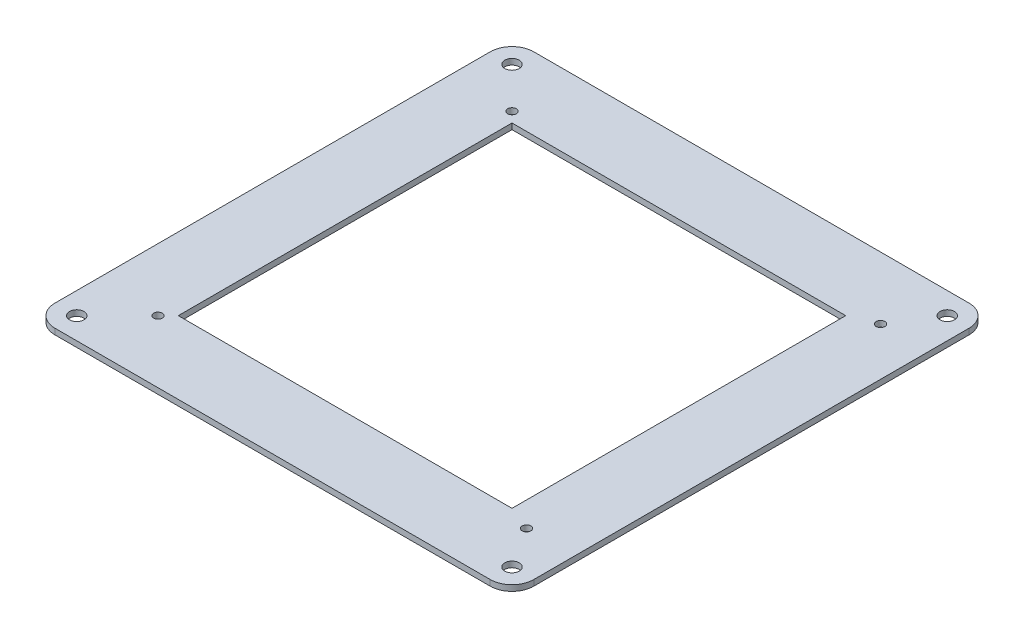
ISO-10303-21;
HEADER;
FILE_DESCRIPTION(('STEP AP214'),'2;1');
FILE_NAME('part.step','',(''),(''),'','','');
FILE_SCHEMA(('AUTOMOTIVE_DESIGN { 1 0 10303 214 1 1 1 1 }'));
ENDSEC;
DATA;
#1=APPLICATION_CONTEXT('core data for automotive mechanical design processes');
#2=APPLICATION_PROTOCOL_DEFINITION('international standard','automotive_design',2000,#1);
#3=PRODUCT_CONTEXT('',#1,'mechanical');
#4=PRODUCT('Part','Part','',(#3));
#5=PRODUCT_RELATED_PRODUCT_CATEGORY('part','',(#4));
#6=PRODUCT_DEFINITION_FORMATION('','',#4);
#7=PRODUCT_DEFINITION_CONTEXT('part definition',#1,'design');
#8=PRODUCT_DEFINITION('design','',#6,#7);
#9=PRODUCT_DEFINITION_SHAPE('','',#8);
#10=(LENGTH_UNIT() NAMED_UNIT(*) SI_UNIT(.MILLI.,.METRE.));
#11=(NAMED_UNIT(*) PLANE_ANGLE_UNIT() SI_UNIT($,.RADIAN.));
#12=(NAMED_UNIT(*) SI_UNIT($,.STERADIAN.) SOLID_ANGLE_UNIT());
#13=UNCERTAINTY_MEASURE_WITH_UNIT(LENGTH_MEASURE(1.E-05),#10,'distance_accuracy_value','');
#14=(GEOMETRIC_REPRESENTATION_CONTEXT(3) GLOBAL_UNCERTAINTY_ASSIGNED_CONTEXT((#13)) GLOBAL_UNIT_ASSIGNED_CONTEXT((#10,
#11,#12)) REPRESENTATION_CONTEXT('',''));
#15=CARTESIAN_POINT('',(0.,0.,0.));
#16=DIRECTION('',(0.,0.,1.));
#17=DIRECTION('',(1.,0.,0.));
#18=AXIS2_PLACEMENT_3D('',#15,#16,#17);
#19=CARTESIAN_POINT('',(0.,2.,0.));
#20=DIRECTION('',(0.,1.,0.));
#21=DIRECTION('',(0.,0.,1.));
#22=AXIS2_PLACEMENT_3D('',#19,#20,#21);
#23=PLANE('',#22);
#24=DIRECTION('',(0.,0.,-1.));
#25=VECTOR('',#24,1.);
#26=CARTESIAN_POINT('',(57.5000000000001,2.,0.));
#27=LINE('',#26,#25);
#28=CARTESIAN_POINT('',(57.5000000000001,2.,57.5000000000001));
#29=VERTEX_POINT('',#28);
#30=CARTESIAN_POINT('',(57.5000000000001,2.,-57.4999999999998));
#31=VERTEX_POINT('',#30);
#32=EDGE_CURVE('E198',#29,#31,#27,.T.);
#33=ORIENTED_EDGE('',*,*,#32,.F.);
#34=DIRECTION('',(1.,0.,0.));
#35=VECTOR('',#34,1.);
#36=CARTESIAN_POINT('',(0.,2.,57.5000000000001));
#37=LINE('',#36,#35);
#38=CARTESIAN_POINT('',(-57.4999999999999,2.,57.5000000000001));
#39=VERTEX_POINT('',#38);
#40=EDGE_CURVE('E201',#39,#29,#37,.T.);
#41=ORIENTED_EDGE('',*,*,#40,.F.);
#42=DIRECTION('',(0.,0.,-1.));
#43=VECTOR('',#42,1.);
#44=CARTESIAN_POINT('',(-57.4999999999999,2.,0.));
#45=LINE('',#44,#43);
#46=CARTESIAN_POINT('',(-57.4999999999999,2.,-57.4999999999998));
#47=VERTEX_POINT('',#46);
#48=EDGE_CURVE('E204',#39,#47,#45,.T.);
#49=ORIENTED_EDGE('',*,*,#48,.T.);
#50=DIRECTION('',(1.,0.,0.));
#51=VECTOR('',#50,1.);
#52=CARTESIAN_POINT('',(0.,2.,-57.4999999999998));
#53=LINE('',#52,#51);
#54=EDGE_CURVE('E207',#47,#31,#53,.T.);
#55=ORIENTED_EDGE('',*,*,#54,.T.);
#56=EDGE_LOOP('',(#33,#41,#49,#55));
#57=FACE_BOUND('',#56,.T.);
#58=CARTESIAN_POINT('',(-75.,2.,-74.9999999999999));
#59=DIRECTION('',(0.,1.,0.));
#60=DIRECTION('',(0.,0.,1.));
#61=AXIS2_PLACEMENT_3D('',#58,#59,#60);
#62=CIRCLE('',#61,2.5);
#63=CARTESIAN_POINT('',(-75.,2.,-72.4999999999999));
#64=VERTEX_POINT('',#63);
#65=EDGE_CURVE('E195',#64,#64,#62,.T.);
#66=ORIENTED_EDGE('',*,*,#65,.F.);
#67=EDGE_LOOP('',(#66));
#68=FACE_BOUND('',#67,.T.);
#69=CARTESIAN_POINT('',(75.0000000000001,2.,-74.9999999999999));
#70=DIRECTION('',(0.,1.,0.));
#71=DIRECTION('',(0.,0.,1.));
#72=AXIS2_PLACEMENT_3D('',#69,#70,#71);
#73=CIRCLE('',#72,2.5);
#74=CARTESIAN_POINT('',(75.0000000000001,2.,-72.4999999999999));
#75=VERTEX_POINT('',#74);
#76=EDGE_CURVE('E192',#75,#75,#73,.T.);
#77=ORIENTED_EDGE('',*,*,#76,.F.);
#78=EDGE_LOOP('',(#77));
#79=FACE_BOUND('',#78,.T.);
#80=CARTESIAN_POINT('',(75.0000000000001,2.,75.));
#81=DIRECTION('',(0.,1.,0.));
#82=DIRECTION('',(0.,0.,1.));
#83=AXIS2_PLACEMENT_3D('',#80,#81,#82);
#84=CIRCLE('',#83,2.50000000000001);
#85=CARTESIAN_POINT('',(75.0000000000001,2.,77.5));
#86=VERTEX_POINT('',#85);
#87=EDGE_CURVE('E189',#86,#86,#84,.T.);
#88=ORIENTED_EDGE('',*,*,#87,.F.);
#89=EDGE_LOOP('',(#88));
#90=FACE_BOUND('',#89,.T.);
#91=CARTESIAN_POINT('',(-75.,2.,75.));
#92=DIRECTION('',(0.,1.,0.));
#93=DIRECTION('',(0.,0.,1.));
#94=AXIS2_PLACEMENT_3D('',#91,#92,#93);
#95=CIRCLE('',#94,2.5);
#96=CARTESIAN_POINT('',(-75.,2.,77.5));
#97=VERTEX_POINT('',#96);
#98=EDGE_CURVE('E186',#97,#97,#95,.T.);
#99=ORIENTED_EDGE('',*,*,#98,.F.);
#100=EDGE_LOOP('',(#99));
#101=FACE_BOUND('',#100,.T.);
#102=CARTESIAN_POINT('',(-61.,2.,-61.));
#103=DIRECTION('',(0.,1.,0.));
#104=DIRECTION('',(0.,0.,1.));
#105=AXIS2_PLACEMENT_3D('',#102,#103,#104);
#106=CIRCLE('',#105,1.5);
#107=CARTESIAN_POINT('',(-61.,2.,-59.5));
#108=VERTEX_POINT('',#107);
#109=EDGE_CURVE('E183',#108,#108,#106,.T.);
#110=ORIENTED_EDGE('',*,*,#109,.F.);
#111=EDGE_LOOP('',(#110));
#112=FACE_BOUND('',#111,.T.);
#113=CARTESIAN_POINT('',(66.,2.,-61.));
#114=DIRECTION('',(0.,1.,0.));
#115=DIRECTION('',(0.,0.,1.));
#116=AXIS2_PLACEMENT_3D('',#113,#114,#115);
#117=CIRCLE('',#116,1.5);
#118=CARTESIAN_POINT('',(66.,2.,-59.5));
#119=VERTEX_POINT('',#118);
#120=EDGE_CURVE('E180',#119,#119,#117,.T.);
#121=ORIENTED_EDGE('',*,*,#120,.F.);
#122=EDGE_LOOP('',(#121));
#123=FACE_BOUND('',#122,.T.);
#124=CARTESIAN_POINT('',(66.,2.,61.));
#125=DIRECTION('',(0.,1.,0.));
#126=DIRECTION('',(0.,0.,1.));
#127=AXIS2_PLACEMENT_3D('',#124,#125,#126);
#128=CIRCLE('',#127,1.5);
#129=CARTESIAN_POINT('',(66.,2.,62.5));
#130=VERTEX_POINT('',#129);
#131=EDGE_CURVE('E176',#130,#130,#128,.T.);
#132=ORIENTED_EDGE('',*,*,#131,.F.);
#133=EDGE_LOOP('',(#132));
#134=FACE_BOUND('',#133,.T.);
#135=CARTESIAN_POINT('',(-61.,2.,61.0000000000001));
#136=DIRECTION('',(0.,1.,0.));
#137=DIRECTION('',(0.,0.,1.));
#138=AXIS2_PLACEMENT_3D('',#135,#136,#137);
#139=CIRCLE('',#138,1.5);
#140=CARTESIAN_POINT('',(-61.,2.,62.5000000000001));
#141=VERTEX_POINT('',#140);
#142=EDGE_CURVE('E173',#141,#141,#139,.T.);
#143=ORIENTED_EDGE('',*,*,#142,.F.);
#144=EDGE_LOOP('',(#143));
#145=FACE_BOUND('',#144,.T.);
#146=DIRECTION('',(0.,0.,-1.));
#147=VECTOR('',#146,1.);
#148=CARTESIAN_POINT('',(82.5,2.,75.));
#149=LINE('',#148,#147);
#150=CARTESIAN_POINT('',(82.5,2.,75.));
#151=VERTEX_POINT('',#150);
#152=CARTESIAN_POINT('',(82.5,2.,-74.9999999999999));
#153=VERTEX_POINT('',#152);
#154=EDGE_CURVE('E159',#151,#153,#149,.T.);
#155=ORIENTED_EDGE('',*,*,#154,.T.);
#156=CARTESIAN_POINT('',(75.0000000000001,2.,-74.9999999999999));
#157=DIRECTION('',(0.,1.,0.));
#158=DIRECTION('',(0.,0.,1.));
#159=AXIS2_PLACEMENT_3D('',#156,#157,#158);
#160=CIRCLE('',#159,7.5);
#161=CARTESIAN_POINT('',(75.0000000000001,2.,-82.4999999999999));
#162=VERTEX_POINT('',#161);
#163=EDGE_CURVE('E148',#153,#162,#160,.T.);
#164=ORIENTED_EDGE('',*,*,#163,.T.);
#165=DIRECTION('',(-1.,0.,0.));
#166=VECTOR('',#165,1.);
#167=CARTESIAN_POINT('',(75.0000000000001,2.,-82.4999999999999));
#168=LINE('',#167,#166);
#169=CARTESIAN_POINT('',(-75.,2.,-82.4999999999999));
#170=VERTEX_POINT('',#169);
#171=EDGE_CURVE('E146',#162,#170,#168,.T.);
#172=ORIENTED_EDGE('',*,*,#171,.T.);
#173=CARTESIAN_POINT('',(-75.,2.,-74.9999999999999));
#174=DIRECTION('',(0.,1.,0.));
#175=DIRECTION('',(0.,0.,1.));
#176=AXIS2_PLACEMENT_3D('',#173,#174,#175);
#177=CIRCLE('',#176,7.50000000000001);
#178=CARTESIAN_POINT('',(-82.5,2.,-74.9999999999999));
#179=VERTEX_POINT('',#178);
#180=EDGE_CURVE('E52',#170,#179,#177,.T.);
#181=ORIENTED_EDGE('',*,*,#180,.T.);
#182=DIRECTION('',(0.,0.,1.));
#183=VECTOR('',#182,1.);
#184=CARTESIAN_POINT('',(-82.5,2.,75.));
#185=LINE('',#184,#183);
#186=CARTESIAN_POINT('',(-82.5,2.,75.));
#187=VERTEX_POINT('',#186);
#188=EDGE_CURVE('E135',#179,#187,#185,.T.);
#189=ORIENTED_EDGE('',*,*,#188,.T.);
#190=CARTESIAN_POINT('',(-75.,2.,75.));
#191=DIRECTION('',(0.,1.,0.));
#192=DIRECTION('',(0.,0.,1.));
#193=AXIS2_PLACEMENT_3D('',#190,#191,#192);
#194=CIRCLE('',#193,7.50000000000001);
#195=CARTESIAN_POINT('',(-75.,2.,82.5));
#196=VERTEX_POINT('',#195);
#197=EDGE_CURVE('E141',#187,#196,#194,.T.);
#198=ORIENTED_EDGE('',*,*,#197,.T.);
#199=DIRECTION('',(1.,0.,0.));
#200=VECTOR('',#199,1.);
#201=CARTESIAN_POINT('',(75.0000000000001,2.,82.5));
#202=LINE('',#201,#200);
#203=CARTESIAN_POINT('',(75.0000000000001,2.,82.5));
#204=VERTEX_POINT('',#203);
#205=EDGE_CURVE('E153',#196,#204,#202,.T.);
#206=ORIENTED_EDGE('',*,*,#205,.T.);
#207=CARTESIAN_POINT('',(75.0000000000001,2.,75.));
#208=DIRECTION('',(0.,1.,0.));
#209=DIRECTION('',(0.,0.,1.));
#210=AXIS2_PLACEMENT_3D('',#207,#208,#209);
#211=CIRCLE('',#210,7.49999999999999);
#212=EDGE_CURVE('E156',#204,#151,#211,.T.);
#213=ORIENTED_EDGE('',*,*,#212,.T.);
#214=EDGE_LOOP('',(#155,#164,#172,#181,#189,#198,#206,#213));
#215=FACE_BOUND('',#214,.T.);
#216=ADVANCED_FACE('F37',(#57,#68,#79,#90,#101,#112,#123,#134,#145,#215),#23,.T.);
#217=CARTESIAN_POINT('',(0.,0.,0.));
#218=DIRECTION('',(0.,1.,0.));
#219=DIRECTION('',(0.,0.,1.));
#220=AXIS2_PLACEMENT_3D('',#217,#218,#219);
#221=PLANE('',#220);
#222=DIRECTION('',(0.,0.,-1.));
#223=VECTOR('',#222,1.);
#224=CARTESIAN_POINT('',(57.5000000000001,0.,0.));
#225=LINE('',#224,#223);
#226=CARTESIAN_POINT('',(57.5000000000001,0.,57.5000000000001));
#227=VERTEX_POINT('',#226);
#228=CARTESIAN_POINT('',(57.5000000000001,0.,-57.4999999999998));
#229=VERTEX_POINT('',#228);
#230=EDGE_CURVE('E233',#227,#229,#225,.T.);
#231=ORIENTED_EDGE('',*,*,#230,.T.);
#232=DIRECTION('',(1.,0.,0.));
#233=VECTOR('',#232,1.);
#234=CARTESIAN_POINT('',(0.,0.,-57.4999999999998));
#235=LINE('',#234,#233);
#236=CARTESIAN_POINT('',(-57.4999999999999,0.,-57.4999999999998));
#237=VERTEX_POINT('',#236);
#238=EDGE_CURVE('E177',#237,#229,#235,.T.);
#239=ORIENTED_EDGE('',*,*,#238,.F.);
#240=DIRECTION('',(0.,0.,-1.));
#241=VECTOR('',#240,1.);
#242=CARTESIAN_POINT('',(-57.4999999999999,0.,0.));
#243=LINE('',#242,#241);
#244=CARTESIAN_POINT('',(-57.4999999999999,0.,57.5000000000001));
#245=VERTEX_POINT('',#244);
#246=EDGE_CURVE('E239',#245,#237,#243,.T.);
#247=ORIENTED_EDGE('',*,*,#246,.F.);
#248=DIRECTION('',(1.,0.,0.));
#249=VECTOR('',#248,1.);
#250=CARTESIAN_POINT('',(0.,0.,57.5000000000001));
#251=LINE('',#250,#249);
#252=EDGE_CURVE('E236',#245,#227,#251,.T.);
#253=ORIENTED_EDGE('',*,*,#252,.T.);
#254=EDGE_LOOP('',(#231,#239,#247,#253));
#255=FACE_BOUND('',#254,.T.);
#256=CARTESIAN_POINT('',(-75.,0.,-74.9999999999999));
#257=DIRECTION('',(0.,1.,0.));
#258=DIRECTION('',(0.,0.,1.));
#259=AXIS2_PLACEMENT_3D('',#256,#257,#258);
#260=CIRCLE('',#259,2.5);
#261=CARTESIAN_POINT('',(-75.,0.,-72.4999999999999));
#262=VERTEX_POINT('',#261);
#263=EDGE_CURVE('E230',#262,#262,#260,.T.);
#264=ORIENTED_EDGE('',*,*,#263,.T.);
#265=EDGE_LOOP('',(#264));
#266=FACE_BOUND('',#265,.T.);
#267=CARTESIAN_POINT('',(75.0000000000001,0.,-74.9999999999999));
#268=DIRECTION('',(0.,1.,0.));
#269=DIRECTION('',(0.,0.,1.));
#270=AXIS2_PLACEMENT_3D('',#267,#268,#269);
#271=CIRCLE('',#270,2.5);
#272=CARTESIAN_POINT('',(75.0000000000001,0.,-72.4999999999999));
#273=VERTEX_POINT('',#272);
#274=EDGE_CURVE('E227',#273,#273,#271,.T.);
#275=ORIENTED_EDGE('',*,*,#274,.T.);
#276=EDGE_LOOP('',(#275));
#277=FACE_BOUND('',#276,.T.);
#278=CARTESIAN_POINT('',(75.0000000000001,0.,75.));
#279=DIRECTION('',(0.,1.,0.));
#280=DIRECTION('',(0.,0.,1.));
#281=AXIS2_PLACEMENT_3D('',#278,#279,#280);
#282=CIRCLE('',#281,2.50000000000001);
#283=CARTESIAN_POINT('',(75.0000000000001,0.,77.5));
#284=VERTEX_POINT('',#283);
#285=EDGE_CURVE('E224',#284,#284,#282,.T.);
#286=ORIENTED_EDGE('',*,*,#285,.T.);
#287=EDGE_LOOP('',(#286));
#288=FACE_BOUND('',#287,.T.);
#289=CARTESIAN_POINT('',(-75.,0.,75.));
#290=DIRECTION('',(0.,1.,0.));
#291=DIRECTION('',(0.,0.,1.));
#292=AXIS2_PLACEMENT_3D('',#289,#290,#291);
#293=CIRCLE('',#292,2.5);
#294=CARTESIAN_POINT('',(-75.,0.,77.5));
#295=VERTEX_POINT('',#294);
#296=EDGE_CURVE('E221',#295,#295,#293,.T.);
#297=ORIENTED_EDGE('',*,*,#296,.T.);
#298=EDGE_LOOP('',(#297));
#299=FACE_BOUND('',#298,.T.);
#300=CARTESIAN_POINT('',(-61.,0.,-61.));
#301=DIRECTION('',(0.,1.,0.));
#302=DIRECTION('',(0.,0.,1.));
#303=AXIS2_PLACEMENT_3D('',#300,#301,#302);
#304=CIRCLE('',#303,1.5);
#305=CARTESIAN_POINT('',(-61.,0.,-59.5));
#306=VERTEX_POINT('',#305);
#307=EDGE_CURVE('E218',#306,#306,#304,.T.);
#308=ORIENTED_EDGE('',*,*,#307,.T.);
#309=EDGE_LOOP('',(#308));
#310=FACE_BOUND('',#309,.T.);
#311=CARTESIAN_POINT('',(66.,0.,-61.));
#312=DIRECTION('',(0.,1.,0.));
#313=DIRECTION('',(0.,0.,1.));
#314=AXIS2_PLACEMENT_3D('',#311,#312,#313);
#315=CIRCLE('',#314,1.5);
#316=CARTESIAN_POINT('',(66.,0.,-59.5));
#317=VERTEX_POINT('',#316);
#318=EDGE_CURVE('E215',#317,#317,#315,.T.);
#319=ORIENTED_EDGE('',*,*,#318,.T.);
#320=EDGE_LOOP('',(#319));
#321=FACE_BOUND('',#320,.T.);
#322=CARTESIAN_POINT('',(66.,0.,61.));
#323=DIRECTION('',(0.,1.,0.));
#324=DIRECTION('',(0.,0.,1.));
#325=AXIS2_PLACEMENT_3D('',#322,#323,#324);
#326=CIRCLE('',#325,1.5);
#327=CARTESIAN_POINT('',(66.,0.,62.5));
#328=VERTEX_POINT('',#327);
#329=EDGE_CURVE('E212',#328,#328,#326,.T.);
#330=ORIENTED_EDGE('',*,*,#329,.T.);
#331=EDGE_LOOP('',(#330));
#332=FACE_BOUND('',#331,.T.);
#333=CARTESIAN_POINT('',(-61.,0.,61.0000000000001));
#334=DIRECTION('',(0.,1.,0.));
#335=DIRECTION('',(0.,0.,1.));
#336=AXIS2_PLACEMENT_3D('',#333,#334,#335);
#337=CIRCLE('',#336,1.5);
#338=CARTESIAN_POINT('',(-61.,0.,62.5000000000001));
#339=VERTEX_POINT('',#338);
#340=EDGE_CURVE('E163',#339,#339,#337,.T.);
#341=ORIENTED_EDGE('',*,*,#340,.T.);
#342=EDGE_LOOP('',(#341));
#343=FACE_BOUND('',#342,.T.);
#344=CARTESIAN_POINT('',(75.0000000000001,0.,-74.9999999999999));
#345=DIRECTION('',(0.,1.,0.));
#346=DIRECTION('',(0.,0.,1.));
#347=AXIS2_PLACEMENT_3D('',#344,#345,#346);
#348=CIRCLE('',#347,7.5);
#349=CARTESIAN_POINT('',(82.5,0.,-74.9999999999999));
#350=VERTEX_POINT('',#349);
#351=CARTESIAN_POINT('',(75.0000000000001,0.,-82.4999999999999));
#352=VERTEX_POINT('',#351);
#353=EDGE_CURVE('E11',#350,#352,#348,.T.);
#354=ORIENTED_EDGE('',*,*,#353,.F.);
#355=DIRECTION('',(0.,0.,-1.));
#356=VECTOR('',#355,1.);
#357=CARTESIAN_POINT('',(82.5,0.,0.));
#358=LINE('',#357,#356);
#359=CARTESIAN_POINT('',(82.5,0.,75.));
#360=VERTEX_POINT('',#359);
#361=EDGE_CURVE('E45',#360,#350,#358,.T.);
#362=ORIENTED_EDGE('',*,*,#361,.F.);
#363=CARTESIAN_POINT('',(75.0000000000001,0.,75.));
#364=DIRECTION('',(0.,1.,0.));
#365=DIRECTION('',(0.,0.,1.));
#366=AXIS2_PLACEMENT_3D('',#363,#364,#365);
#367=CIRCLE('',#366,7.49999999999999);
#368=CARTESIAN_POINT('',(75.0000000000001,0.,82.5));
#369=VERTEX_POINT('',#368);
#370=EDGE_CURVE('E261',#369,#360,#367,.T.);
#371=ORIENTED_EDGE('',*,*,#370,.F.);
#372=DIRECTION('',(1.,0.,0.));
#373=VECTOR('',#372,1.);
#374=CARTESIAN_POINT('',(0.,0.,82.5));
#375=LINE('',#374,#373);
#376=CARTESIAN_POINT('',(-75.,0.,82.5));
#377=VERTEX_POINT('',#376);
#378=EDGE_CURVE('E259',#377,#369,#375,.T.);
#379=ORIENTED_EDGE('',*,*,#378,.F.);
#380=CARTESIAN_POINT('',(-75.,0.,75.));
#381=DIRECTION('',(0.,1.,0.));
#382=DIRECTION('',(0.,0.,1.));
#383=AXIS2_PLACEMENT_3D('',#380,#381,#382);
#384=CIRCLE('',#383,7.50000000000001);
#385=CARTESIAN_POINT('',(-82.5,0.,75.));
#386=VERTEX_POINT('',#385);
#387=EDGE_CURVE('E257',#386,#377,#384,.T.);
#388=ORIENTED_EDGE('',*,*,#387,.F.);
#389=DIRECTION('',(0.,0.,1.));
#390=VECTOR('',#389,1.);
#391=CARTESIAN_POINT('',(-82.5,0.,0.));
#392=LINE('',#391,#390);
#393=CARTESIAN_POINT('',(-82.5,0.,-74.9999999999999));
#394=VERTEX_POINT('',#393);
#395=EDGE_CURVE('E255',#394,#386,#392,.T.);
#396=ORIENTED_EDGE('',*,*,#395,.F.);
#397=CARTESIAN_POINT('',(-75.,0.,-74.9999999999999));
#398=DIRECTION('',(0.,1.,0.));
#399=DIRECTION('',(0.,0.,1.));
#400=AXIS2_PLACEMENT_3D('',#397,#398,#399);
#401=CIRCLE('',#400,7.50000000000001);
#402=CARTESIAN_POINT('',(-75.,0.,-82.4999999999999));
#403=VERTEX_POINT('',#402);
#404=EDGE_CURVE('E128',#403,#394,#401,.T.);
#405=ORIENTED_EDGE('',*,*,#404,.F.);
#406=DIRECTION('',(-1.,0.,0.));
#407=VECTOR('',#406,1.);
#408=CARTESIAN_POINT('',(0.,0.,-82.4999999999999));
#409=LINE('',#408,#407);
#410=EDGE_CURVE('E252',#352,#403,#409,.T.);
#411=ORIENTED_EDGE('',*,*,#410,.F.);
#412=EDGE_LOOP('',(#354,#362,#371,#379,#388,#396,#405,#411));
#413=FACE_BOUND('',#412,.T.);
#414=ADVANCED_FACE('F275',(#255,#266,#277,#288,#299,#310,#321,#332,#343,#413),#221,.F.);
#415=CARTESIAN_POINT('',(57.5000000000001,2.,0.));
#416=DIRECTION('',(-1.,0.,0.));
#417=DIRECTION('',(0.,0.,1.));
#418=AXIS2_PLACEMENT_3D('',#415,#416,#417);
#419=PLANE('',#418);
#420=ORIENTED_EDGE('',*,*,#230,.F.);
#421=DIRECTION('',(0.,-1.,0.));
#422=VECTOR('',#421,1.);
#423=CARTESIAN_POINT('',(57.5000000000001,2.,57.5000000000001));
#424=LINE('',#423,#422);
#425=EDGE_CURVE('E250',#29,#227,#424,.T.);
#426=ORIENTED_EDGE('',*,*,#425,.F.);
#427=ORIENTED_EDGE('',*,*,#32,.T.);
#428=DIRECTION('',(0.,-1.,0.));
#429=VECTOR('',#428,1.);
#430=CARTESIAN_POINT('',(57.5000000000001,2.,-57.4999999999998));
#431=LINE('',#430,#429);
#432=EDGE_CURVE('E209',#31,#229,#431,.T.);
#433=ORIENTED_EDGE('',*,*,#432,.T.);
#434=EDGE_LOOP('',(#420,#426,#427,#433));
#435=FACE_BOUND('',#434,.T.);
#436=ADVANCED_FACE('F304',(#435),#419,.T.);
#437=CARTESIAN_POINT('',(0.,2.,57.5000000000001));
#438=DIRECTION('',(0.,0.,-1.));
#439=DIRECTION('',(-1.,0.,0.));
#440=AXIS2_PLACEMENT_3D('',#437,#438,#439);
#441=PLANE('',#440);
#442=ORIENTED_EDGE('',*,*,#252,.F.);
#443=DIRECTION('',(0.,-1.,0.));
#444=VECTOR('',#443,1.);
#445=CARTESIAN_POINT('',(-57.4999999999999,2.,57.5000000000001));
#446=LINE('',#445,#444);
#447=EDGE_CURVE('E248',#39,#245,#446,.T.);
#448=ORIENTED_EDGE('',*,*,#447,.F.);
#449=ORIENTED_EDGE('',*,*,#40,.T.);
#450=ORIENTED_EDGE('',*,*,#425,.T.);
#451=EDGE_LOOP('',(#442,#448,#449,#450));
#452=FACE_BOUND('',#451,.T.);
#453=ADVANCED_FACE('F320',(#452),#441,.T.);
#454=CARTESIAN_POINT('',(-57.4999999999999,2.,0.));
#455=DIRECTION('',(-1.,0.,0.));
#456=DIRECTION('',(0.,0.,1.));
#457=AXIS2_PLACEMENT_3D('',#454,#455,#456);
#458=PLANE('',#457);
#459=ORIENTED_EDGE('',*,*,#246,.T.);
#460=DIRECTION('',(0.,-1.,0.));
#461=VECTOR('',#460,1.);
#462=CARTESIAN_POINT('',(-57.4999999999999,2.,-57.4999999999998));
#463=LINE('',#462,#461);
#464=EDGE_CURVE('E245',#47,#237,#463,.T.);
#465=ORIENTED_EDGE('',*,*,#464,.F.);
#466=ORIENTED_EDGE('',*,*,#48,.F.);
#467=ORIENTED_EDGE('',*,*,#447,.T.);
#468=EDGE_LOOP('',(#459,#465,#466,#467));
#469=FACE_BOUND('',#468,.T.);
#470=ADVANCED_FACE('F316',(#469),#458,.F.);
#471=CARTESIAN_POINT('',(0.,2.,-57.4999999999998));
#472=DIRECTION('',(0.,0.,-1.));
#473=DIRECTION('',(-1.,0.,0.));
#474=AXIS2_PLACEMENT_3D('',#471,#472,#473);
#475=PLANE('',#474);
#476=ORIENTED_EDGE('',*,*,#238,.T.);
#477=ORIENTED_EDGE('',*,*,#432,.F.);
#478=ORIENTED_EDGE('',*,*,#54,.F.);
#479=ORIENTED_EDGE('',*,*,#464,.T.);
#480=EDGE_LOOP('',(#476,#477,#478,#479));
#481=FACE_BOUND('',#480,.T.);
#482=ADVANCED_FACE('F312',(#481),#475,.F.);
#483=CARTESIAN_POINT('',(-75.,2.,-74.9999999999999));
#484=DIRECTION('',(0.,-1.,0.));
#485=DIRECTION('',(0.,0.,-1.));
#486=AXIS2_PLACEMENT_3D('',#483,#484,#485);
#487=CYLINDRICAL_SURFACE('',#486,2.5);
#488=ORIENTED_EDGE('',*,*,#65,.T.);
#489=EDGE_LOOP('',(#488));
#490=FACE_BOUND('',#489,.T.);
#491=ORIENTED_EDGE('',*,*,#263,.F.);
#492=EDGE_LOOP('',(#491));
#493=FACE_BOUND('',#492,.T.);
#494=ADVANCED_FACE('F315',(#490,#493),#487,.F.);
#495=CARTESIAN_POINT('',(75.0000000000001,2.,-74.9999999999999));
#496=DIRECTION('',(0.,-1.,0.));
#497=DIRECTION('',(0.,0.,-1.));
#498=AXIS2_PLACEMENT_3D('',#495,#496,#497);
#499=CYLINDRICAL_SURFACE('',#498,2.5);
#500=ORIENTED_EDGE('',*,*,#76,.T.);
#501=EDGE_LOOP('',(#500));
#502=FACE_BOUND('',#501,.T.);
#503=ORIENTED_EDGE('',*,*,#274,.F.);
#504=EDGE_LOOP('',(#503));
#505=FACE_BOUND('',#504,.T.);
#506=ADVANCED_FACE('F330',(#502,#505),#499,.F.);
#507=CARTESIAN_POINT('',(75.0000000000001,2.,75.));
#508=DIRECTION('',(0.,-1.,0.));
#509=DIRECTION('',(0.,0.,-1.));
#510=AXIS2_PLACEMENT_3D('',#507,#508,#509);
#511=CYLINDRICAL_SURFACE('',#510,2.50000000000001);
#512=ORIENTED_EDGE('',*,*,#87,.T.);
#513=EDGE_LOOP('',(#512));
#514=FACE_BOUND('',#513,.T.);
#515=ORIENTED_EDGE('',*,*,#285,.F.);
#516=EDGE_LOOP('',(#515));
#517=FACE_BOUND('',#516,.T.);
#518=ADVANCED_FACE('F334',(#514,#517),#511,.F.);
#519=CARTESIAN_POINT('',(-75.,2.,75.));
#520=DIRECTION('',(0.,-1.,0.));
#521=DIRECTION('',(0.,0.,-1.));
#522=AXIS2_PLACEMENT_3D('',#519,#520,#521);
#523=CYLINDRICAL_SURFACE('',#522,2.5);
#524=ORIENTED_EDGE('',*,*,#98,.T.);
#525=EDGE_LOOP('',(#524));
#526=FACE_BOUND('',#525,.T.);
#527=ORIENTED_EDGE('',*,*,#296,.F.);
#528=EDGE_LOOP('',(#527));
#529=FACE_BOUND('',#528,.T.);
#530=ADVANCED_FACE('F338',(#526,#529),#523,.F.);
#531=CARTESIAN_POINT('',(-61.,2.,-61.));
#532=DIRECTION('',(0.,-1.,0.));
#533=DIRECTION('',(0.,0.,-1.));
#534=AXIS2_PLACEMENT_3D('',#531,#532,#533);
#535=CYLINDRICAL_SURFACE('',#534,1.5);
#536=ORIENTED_EDGE('',*,*,#109,.T.);
#537=EDGE_LOOP('',(#536));
#538=FACE_BOUND('',#537,.T.);
#539=ORIENTED_EDGE('',*,*,#307,.F.);
#540=EDGE_LOOP('',(#539));
#541=FACE_BOUND('',#540,.T.);
#542=ADVANCED_FACE('F342',(#538,#541),#535,.F.);
#543=CARTESIAN_POINT('',(66.,2.,-61.));
#544=DIRECTION('',(0.,-1.,0.));
#545=DIRECTION('',(0.,0.,-1.));
#546=AXIS2_PLACEMENT_3D('',#543,#544,#545);
#547=CYLINDRICAL_SURFACE('',#546,1.5);
#548=ORIENTED_EDGE('',*,*,#120,.T.);
#549=EDGE_LOOP('',(#548));
#550=FACE_BOUND('',#549,.T.);
#551=ORIENTED_EDGE('',*,*,#318,.F.);
#552=EDGE_LOOP('',(#551));
#553=FACE_BOUND('',#552,.T.);
#554=ADVANCED_FACE('F346',(#550,#553),#547,.F.);
#555=CARTESIAN_POINT('',(66.,2.,61.));
#556=DIRECTION('',(0.,-1.,0.));
#557=DIRECTION('',(0.,0.,-1.));
#558=AXIS2_PLACEMENT_3D('',#555,#556,#557);
#559=CYLINDRICAL_SURFACE('',#558,1.5);
#560=ORIENTED_EDGE('',*,*,#131,.T.);
#561=EDGE_LOOP('',(#560));
#562=FACE_BOUND('',#561,.T.);
#563=ORIENTED_EDGE('',*,*,#329,.F.);
#564=EDGE_LOOP('',(#563));
#565=FACE_BOUND('',#564,.T.);
#566=ADVANCED_FACE('F349',(#562,#565),#559,.F.);
#567=CARTESIAN_POINT('',(-61.,2.,61.0000000000001));
#568=DIRECTION('',(0.,-1.,0.));
#569=DIRECTION('',(0.,0.,-1.));
#570=AXIS2_PLACEMENT_3D('',#567,#568,#569);
#571=CYLINDRICAL_SURFACE('',#570,1.5);
#572=ORIENTED_EDGE('',*,*,#142,.T.);
#573=EDGE_LOOP('',(#572));
#574=FACE_BOUND('',#573,.T.);
#575=ORIENTED_EDGE('',*,*,#340,.F.);
#576=EDGE_LOOP('',(#575));
#577=FACE_BOUND('',#576,.T.);
#578=ADVANCED_FACE('F39',(#574,#577),#571,.F.);
#579=CARTESIAN_POINT('',(75.0000000000001,-8.,-74.9999999999999));
#580=DIRECTION('',(0.,1.,0.));
#581=DIRECTION('',(0.,0.,1.));
#582=AXIS2_PLACEMENT_3D('',#579,#580,#581);
#583=CYLINDRICAL_SURFACE('',#582,7.5);
#584=ORIENTED_EDGE('',*,*,#353,.T.);
#585=DIRECTION('',(0.,1.,0.));
#586=VECTOR('',#585,1.);
#587=CARTESIAN_POINT('',(75.0000000000001,-8.,-82.4999999999999));
#588=LINE('',#587,#586);
#589=EDGE_CURVE('E60',#352,#162,#588,.T.);
#590=ORIENTED_EDGE('',*,*,#589,.T.);
#591=ORIENTED_EDGE('',*,*,#163,.F.);
#592=DIRECTION('',(0.,1.,0.));
#593=VECTOR('',#592,1.);
#594=CARTESIAN_POINT('',(82.5,-8.,-74.9999999999999));
#595=LINE('',#594,#593);
#596=EDGE_CURVE('E161',#350,#153,#595,.T.);
#597=ORIENTED_EDGE('',*,*,#596,.F.);
#598=EDGE_LOOP('',(#584,#590,#591,#597));
#599=FACE_BOUND('',#598,.T.);
#600=ADVANCED_FACE('F273',(#599),#583,.T.);
#601=CARTESIAN_POINT('',(82.5,-8.,75.));
#602=DIRECTION('',(1.,0.,0.));
#603=DIRECTION('',(0.,0.,-1.));
#604=AXIS2_PLACEMENT_3D('',#601,#602,#603);
#605=PLANE('',#604);
#606=ORIENTED_EDGE('',*,*,#361,.T.);
#607=ORIENTED_EDGE('',*,*,#596,.T.);
#608=ORIENTED_EDGE('',*,*,#154,.F.);
#609=DIRECTION('',(0.,1.,0.));
#610=VECTOR('',#609,1.);
#611=CARTESIAN_POINT('',(82.5,-8.,75.));
#612=LINE('',#611,#610);
#613=EDGE_CURVE('E164',#360,#151,#612,.T.);
#614=ORIENTED_EDGE('',*,*,#613,.F.);
#615=EDGE_LOOP('',(#606,#607,#608,#614));
#616=FACE_BOUND('',#615,.T.);
#617=ADVANCED_FACE('F266',(#616),#605,.T.);
#618=CARTESIAN_POINT('',(75.0000000000001,-8.,75.));
#619=DIRECTION('',(0.,1.,0.));
#620=DIRECTION('',(0.,0.,1.));
#621=AXIS2_PLACEMENT_3D('',#618,#619,#620);
#622=CYLINDRICAL_SURFACE('',#621,7.49999999999999);
#623=ORIENTED_EDGE('',*,*,#370,.T.);
#624=ORIENTED_EDGE('',*,*,#613,.T.);
#625=ORIENTED_EDGE('',*,*,#212,.F.);
#626=DIRECTION('',(0.,1.,0.));
#627=VECTOR('',#626,1.);
#628=CARTESIAN_POINT('',(75.0000000000001,-8.,82.5));
#629=LINE('',#628,#627);
#630=EDGE_CURVE('E166',#369,#204,#629,.T.);
#631=ORIENTED_EDGE('',*,*,#630,.F.);
#632=EDGE_LOOP('',(#623,#624,#625,#631));
#633=FACE_BOUND('',#632,.T.);
#634=ADVANCED_FACE('F281',(#633),#622,.T.);
#635=CARTESIAN_POINT('',(75.0000000000001,-8.,82.5));
#636=DIRECTION('',(0.,0.,1.));
#637=DIRECTION('',(1.,0.,0.));
#638=AXIS2_PLACEMENT_3D('',#635,#636,#637);
#639=PLANE('',#638);
#640=ORIENTED_EDGE('',*,*,#378,.T.);
#641=ORIENTED_EDGE('',*,*,#630,.T.);
#642=ORIENTED_EDGE('',*,*,#205,.F.);
#643=DIRECTION('',(0.,1.,0.));
#644=VECTOR('',#643,1.);
#645=CARTESIAN_POINT('',(-75.,-8.,82.5));
#646=LINE('',#645,#644);
#647=EDGE_CURVE('E168',#377,#196,#646,.T.);
#648=ORIENTED_EDGE('',*,*,#647,.F.);
#649=EDGE_LOOP('',(#640,#641,#642,#648));
#650=FACE_BOUND('',#649,.T.);
#651=ADVANCED_FACE('F286',(#650),#639,.T.);
#652=CARTESIAN_POINT('',(-75.,-8.,75.));
#653=DIRECTION('',(0.,1.,0.));
#654=DIRECTION('',(0.,0.,1.));
#655=AXIS2_PLACEMENT_3D('',#652,#653,#654);
#656=CYLINDRICAL_SURFACE('',#655,7.50000000000001);
#657=ORIENTED_EDGE('',*,*,#387,.T.);
#658=ORIENTED_EDGE('',*,*,#647,.T.);
#659=ORIENTED_EDGE('',*,*,#197,.F.);
#660=DIRECTION('',(0.,1.,0.));
#661=VECTOR('',#660,1.);
#662=CARTESIAN_POINT('',(-82.5,-8.,75.));
#663=LINE('',#662,#661);
#664=EDGE_CURVE('E131',#386,#187,#663,.T.);
#665=ORIENTED_EDGE('',*,*,#664,.F.);
#666=EDGE_LOOP('',(#657,#658,#659,#665));
#667=FACE_BOUND('',#666,.T.);
#668=ADVANCED_FACE('F288',(#667),#656,.T.);
#669=CARTESIAN_POINT('',(-82.5,-8.,75.));
#670=DIRECTION('',(-1.,0.,0.));
#671=DIRECTION('',(0.,0.,1.));
#672=AXIS2_PLACEMENT_3D('',#669,#670,#671);
#673=PLANE('',#672);
#674=ORIENTED_EDGE('',*,*,#395,.T.);
#675=ORIENTED_EDGE('',*,*,#664,.T.);
#676=ORIENTED_EDGE('',*,*,#188,.F.);
#677=DIRECTION('',(0.,1.,0.));
#678=VECTOR('',#677,1.);
#679=CARTESIAN_POINT('',(-82.5,-8.,-74.9999999999999));
#680=LINE('',#679,#678);
#681=EDGE_CURVE('E124',#394,#179,#680,.T.);
#682=ORIENTED_EDGE('',*,*,#681,.F.);
#683=EDGE_LOOP('',(#674,#675,#676,#682));
#684=FACE_BOUND('',#683,.T.);
#685=ADVANCED_FACE('F136',(#684),#673,.T.);
#686=CARTESIAN_POINT('',(-75.,-8.,-74.9999999999999));
#687=DIRECTION('',(0.,1.,0.));
#688=DIRECTION('',(0.,0.,1.));
#689=AXIS2_PLACEMENT_3D('',#686,#687,#688);
#690=CYLINDRICAL_SURFACE('',#689,7.50000000000001);
#691=ORIENTED_EDGE('',*,*,#404,.T.);
#692=ORIENTED_EDGE('',*,*,#681,.T.);
#693=ORIENTED_EDGE('',*,*,#180,.F.);
#694=DIRECTION('',(0.,1.,0.));
#695=VECTOR('',#694,1.);
#696=CARTESIAN_POINT('',(-75.,-8.,-82.4999999999999));
#697=LINE('',#696,#695);
#698=EDGE_CURVE('E132',#403,#170,#697,.T.);
#699=ORIENTED_EDGE('',*,*,#698,.F.);
#700=EDGE_LOOP('',(#691,#692,#693,#699));
#701=FACE_BOUND('',#700,.T.);
#702=ADVANCED_FACE('F126',(#701),#690,.T.);
#703=CARTESIAN_POINT('',(75.0000000000001,-8.,-82.4999999999999));
#704=DIRECTION('',(0.,0.,-1.));
#705=DIRECTION('',(-1.,0.,0.));
#706=AXIS2_PLACEMENT_3D('',#703,#704,#705);
#707=PLANE('',#706);
#708=ORIENTED_EDGE('',*,*,#410,.T.);
#709=ORIENTED_EDGE('',*,*,#698,.T.);
#710=ORIENTED_EDGE('',*,*,#171,.F.);
#711=ORIENTED_EDGE('',*,*,#589,.F.);
#712=EDGE_LOOP('',(#708,#709,#710,#711));
#713=FACE_BOUND('',#712,.T.);
#714=ADVANCED_FACE('F276',(#713),#707,.T.);
#715=CLOSED_SHELL('',(#216,#414,#436,#453,#470,#482,#494,#506,#518,#530,#542,#554,#566,#578,
#600,#617,#634,#651,#668,#685,#702,#714));
#716=MANIFOLD_SOLID_BREP('B2',#715);
#717=ADVANCED_BREP_SHAPE_REPRESENTATION('',(#18,#716),#14);
#718=SHAPE_DEFINITION_REPRESENTATION(#9,#717);
ENDSEC;
END-ISO-10303-21;
